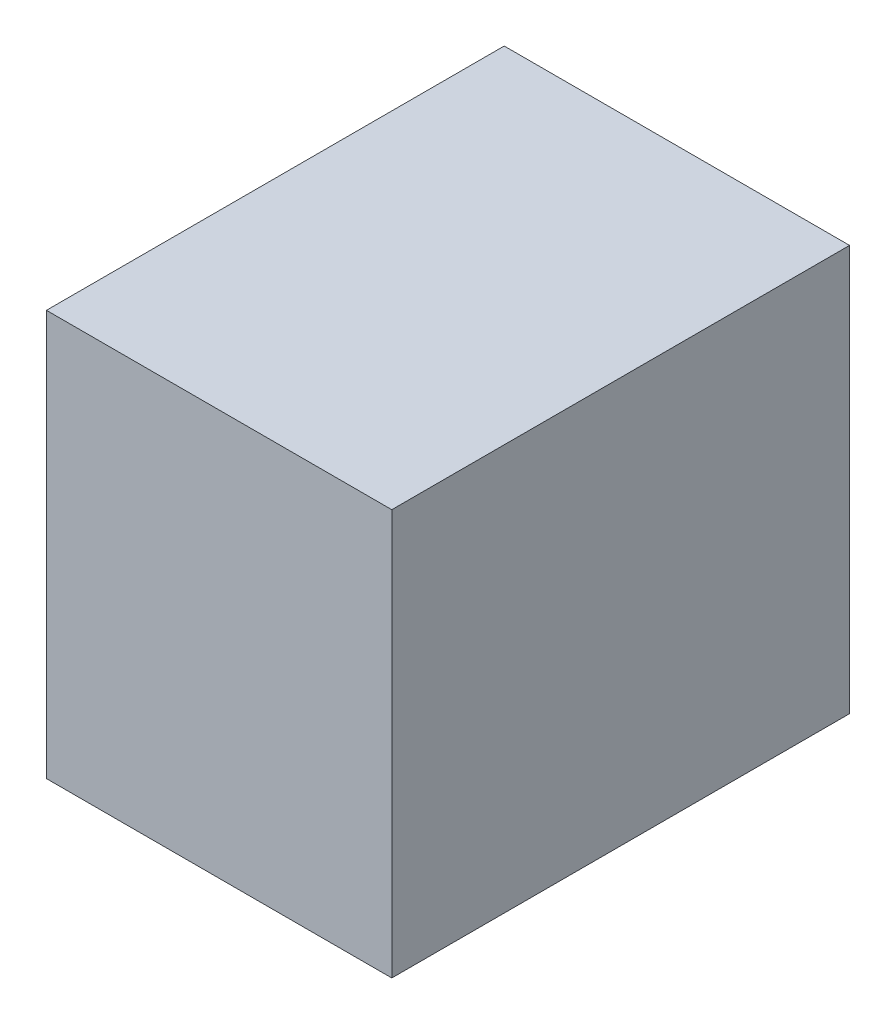
ISO-10303-21;
HEADER;
FILE_DESCRIPTION(('STEP AP214'),'2;1');
FILE_NAME('part.step','',(''),(''),'','','');
FILE_SCHEMA(('AUTOMOTIVE_DESIGN { 1 0 10303 214 1 1 1 1 }'));
ENDSEC;
DATA;
#1=APPLICATION_CONTEXT('core data for automotive mechanical design processes');
#2=APPLICATION_PROTOCOL_DEFINITION('international standard','automotive_design',2000,#1);
#3=PRODUCT_CONTEXT('',#1,'mechanical');
#4=PRODUCT('Part','Part','',(#3));
#5=PRODUCT_RELATED_PRODUCT_CATEGORY('part','',(#4));
#6=PRODUCT_DEFINITION_FORMATION('','',#4);
#7=PRODUCT_DEFINITION_CONTEXT('part definition',#1,'design');
#8=PRODUCT_DEFINITION('design','',#6,#7);
#9=PRODUCT_DEFINITION_SHAPE('','',#8);
#10=(LENGTH_UNIT() NAMED_UNIT(*) SI_UNIT(.MILLI.,.METRE.));
#11=(NAMED_UNIT(*) PLANE_ANGLE_UNIT() SI_UNIT($,.RADIAN.));
#12=(NAMED_UNIT(*) SI_UNIT($,.STERADIAN.) SOLID_ANGLE_UNIT());
#13=UNCERTAINTY_MEASURE_WITH_UNIT(LENGTH_MEASURE(1.E-05),#10,'distance_accuracy_value','');
#14=(GEOMETRIC_REPRESENTATION_CONTEXT(3) GLOBAL_UNCERTAINTY_ASSIGNED_CONTEXT((#13)) GLOBAL_UNIT_ASSIGNED_CONTEXT((#10,
#11,#12)) REPRESENTATION_CONTEXT('',''));
#15=CARTESIAN_POINT('',(0.,0.,0.));
#16=DIRECTION('',(0.,0.,1.));
#17=DIRECTION('',(1.,0.,0.));
#18=AXIS2_PLACEMENT_3D('',#15,#16,#17);
#19=CARTESIAN_POINT('',(3.15957446808511,-6.9967362482587,25.5));
#20=DIRECTION('',(0.,-1.,0.));
#21=DIRECTION('',(1.,0.,0.));
#22=AXIS2_PLACEMENT_3D('',#19,#20,#21);
#23=PLANE('',#22);
#24=DIRECTION('',(-1.,0.,0.));
#25=VECTOR('',#24,1.);
#26=CARTESIAN_POINT('',(3.15957446808511,-6.9967362482587,0.));
#27=LINE('',#26,#25);
#28=CARTESIAN_POINT('',(3.15957446808511,-6.9967362482587,0.));
#29=VERTEX_POINT('',#28);
#30=CARTESIAN_POINT('',(-12.3404255319149,-6.9967362482587,0.));
#31=VERTEX_POINT('',#30);
#32=EDGE_CURVE('E148',#29,#31,#27,.T.);
#33=ORIENTED_EDGE('',*,*,#32,.T.);
#34=DIRECTION('',(0.,0.,-1.));
#35=VECTOR('',#34,1.);
#36=CARTESIAN_POINT('',(-12.3404255319149,-6.9967362482587,25.5));
#37=LINE('',#36,#35);
#38=CARTESIAN_POINT('',(-12.3404255319149,-6.9967362482587,25.5));
#39=VERTEX_POINT('',#38);
#40=EDGE_CURVE('E11',#39,#31,#37,.T.);
#41=ORIENTED_EDGE('',*,*,#40,.F.);
#42=DIRECTION('',(-1.,0.,0.));
#43=VECTOR('',#42,1.);
#44=CARTESIAN_POINT('',(3.15957446808511,-6.9967362482587,25.5));
#45=LINE('',#44,#43);
#46=CARTESIAN_POINT('',(3.15957446808511,-6.9967362482587,25.5));
#47=VERTEX_POINT('',#46);
#48=EDGE_CURVE('E140',#47,#39,#45,.T.);
#49=ORIENTED_EDGE('',*,*,#48,.F.);
#50=DIRECTION('',(0.,0.,-1.));
#51=VECTOR('',#50,1.);
#52=CARTESIAN_POINT('',(3.15957446808511,-6.9967362482587,25.5));
#53=LINE('',#52,#51);
#54=EDGE_CURVE('E147',#47,#29,#53,.T.);
#55=ORIENTED_EDGE('',*,*,#54,.T.);
#56=EDGE_LOOP('',(#33,#41,#49,#55));
#57=FACE_BOUND('',#56,.T.);
#58=ADVANCED_FACE('F36',(#57),#23,.F.);
#59=CARTESIAN_POINT('',(-12.3404255319149,-6.9967362482587,25.5));
#60=DIRECTION('',(-1.,0.,0.));
#61=DIRECTION('',(0.,-1.,0.));
#62=AXIS2_PLACEMENT_3D('',#59,#60,#61);
#63=PLANE('',#62);
#64=DIRECTION('',(0.,1.,0.));
#65=VECTOR('',#64,1.);
#66=CARTESIAN_POINT('',(-12.3404255319149,-6.9967362482587,0.));
#67=LINE('',#66,#65);
#68=CARTESIAN_POINT('',(-12.3404255319149,8.5032637517413,0.));
#69=VERTEX_POINT('',#68);
#70=EDGE_CURVE('E151',#31,#69,#67,.T.);
#71=ORIENTED_EDGE('',*,*,#70,.T.);
#72=DIRECTION('',(0.,0.,-1.));
#73=VECTOR('',#72,1.);
#74=CARTESIAN_POINT('',(-12.3404255319149,8.5032637517413,25.5));
#75=LINE('',#74,#73);
#76=CARTESIAN_POINT('',(-12.3404255319149,8.5032637517413,25.5));
#77=VERTEX_POINT('',#76);
#78=EDGE_CURVE('E44',#77,#69,#75,.T.);
#79=ORIENTED_EDGE('',*,*,#78,.F.);
#80=DIRECTION('',(0.,1.,0.));
#81=VECTOR('',#80,1.);
#82=CARTESIAN_POINT('',(-12.3404255319149,-6.9967362482587,25.5));
#83=LINE('',#82,#81);
#84=EDGE_CURVE('E100',#39,#77,#83,.T.);
#85=ORIENTED_EDGE('',*,*,#84,.F.);
#86=ORIENTED_EDGE('',*,*,#40,.T.);
#87=EDGE_LOOP('',(#71,#79,#85,#86));
#88=FACE_BOUND('',#87,.T.);
#89=ADVANCED_FACE('F225',(#88),#63,.F.);
#90=CARTESIAN_POINT('',(-12.3404255319149,8.5032637517413,25.5));
#91=DIRECTION('',(0.,-1.,0.));
#92=DIRECTION('',(0.,0.,-1.));
#93=AXIS2_PLACEMENT_3D('',#90,#91,#92);
#94=PLANE('',#93);
#95=DIRECTION('',(-1.,0.,0.));
#96=VECTOR('',#95,1.);
#97=CARTESIAN_POINT('',(-12.3404255319149,8.5032637517413,0.));
#98=LINE('',#97,#96);
#99=CARTESIAN_POINT('',(-15.3404255319149,8.5032637517413,0.));
#100=VERTEX_POINT('',#99);
#101=EDGE_CURVE('E115',#69,#100,#98,.T.);
#102=ORIENTED_EDGE('',*,*,#101,.T.);
#103=DIRECTION('',(0.,0.,-1.));
#104=VECTOR('',#103,1.);
#105=CARTESIAN_POINT('',(-15.3404255319149,8.5032637517413,25.5));
#106=LINE('',#105,#104);
#107=CARTESIAN_POINT('',(-15.3404255319149,8.5032637517413,25.5));
#108=VERTEX_POINT('',#107);
#109=EDGE_CURVE('E109',#108,#100,#106,.T.);
#110=ORIENTED_EDGE('',*,*,#109,.F.);
#111=DIRECTION('',(-1.,0.,0.));
#112=VECTOR('',#111,1.);
#113=CARTESIAN_POINT('',(-12.3404255319149,8.5032637517413,25.5));
#114=LINE('',#113,#112);
#115=EDGE_CURVE('E113',#77,#108,#114,.T.);
#116=ORIENTED_EDGE('',*,*,#115,.F.);
#117=ORIENTED_EDGE('',*,*,#78,.T.);
#118=EDGE_LOOP('',(#102,#110,#116,#117));
#119=FACE_BOUND('',#118,.T.);
#120=ADVANCED_FACE('F111',(#119),#94,.F.);
#121=CARTESIAN_POINT('',(-15.3404255319149,-9.9967362482587,25.5));
#122=DIRECTION('',(0.,1.,0.));
#123=DIRECTION('',(0.,0.,1.));
#124=AXIS2_PLACEMENT_3D('',#121,#122,#123);
#125=PLANE('',#124);
#126=DIRECTION('',(1.,0.,0.));
#127=VECTOR('',#126,1.);
#128=CARTESIAN_POINT('',(-15.3404255319149,-9.9967362482587,0.));
#129=LINE('',#128,#127);
#130=CARTESIAN_POINT('',(-15.3404255319149,-9.9967362482587,0.));
#131=VERTEX_POINT('',#130);
#132=CARTESIAN_POINT('',(6.15957446808511,-9.9967362482587,0.));
#133=VERTEX_POINT('',#132);
#134=EDGE_CURVE('E156',#131,#133,#129,.T.);
#135=ORIENTED_EDGE('',*,*,#134,.T.);
#136=DIRECTION('',(0.,0.,-1.));
#137=VECTOR('',#136,1.);
#138=CARTESIAN_POINT('',(6.15957446808511,-9.9967362482587,25.5));
#139=LINE('',#138,#137);
#140=CARTESIAN_POINT('',(6.15957446808511,-9.9967362482587,28.5));
#141=VERTEX_POINT('',#140);
#142=EDGE_CURVE('E175',#141,#133,#139,.T.);
#143=ORIENTED_EDGE('',*,*,#142,.F.);
#144=DIRECTION('',(1.,0.,0.));
#145=VECTOR('',#144,1.);
#146=CARTESIAN_POINT('',(6.15957446808511,-9.9967362482587,28.5));
#147=LINE('',#146,#145);
#148=CARTESIAN_POINT('',(-15.3404255319149,-9.9967362482587,28.5));
#149=VERTEX_POINT('',#148);
#150=EDGE_CURVE('E134',#149,#141,#147,.T.);
#151=ORIENTED_EDGE('',*,*,#150,.F.);
#152=DIRECTION('',(0.,0.,-1.));
#153=VECTOR('',#152,1.);
#154=CARTESIAN_POINT('',(-15.3404255319149,-9.9967362482587,25.5));
#155=LINE('',#154,#153);
#156=EDGE_CURVE('E119',#149,#131,#155,.T.);
#157=ORIENTED_EDGE('',*,*,#156,.T.);
#158=EDGE_LOOP('',(#135,#143,#151,#157));
#159=FACE_BOUND('',#158,.T.);
#160=ADVANCED_FACE('F189',(#159),#125,.F.);
#161=CARTESIAN_POINT('',(6.15957446808511,-9.9967362482587,25.5));
#162=DIRECTION('',(-1.,0.,0.));
#163=DIRECTION('',(0.,0.,1.));
#164=AXIS2_PLACEMENT_3D('',#161,#162,#163);
#165=PLANE('',#164);
#166=DIRECTION('',(0.,1.,0.));
#167=VECTOR('',#166,1.);
#168=CARTESIAN_POINT('',(6.15957446808511,-9.9967362482587,0.));
#169=LINE('',#168,#167);
#170=CARTESIAN_POINT('',(6.15957446808511,15.2532637517413,0.));
#171=VERTEX_POINT('',#170);
#172=EDGE_CURVE('E158',#133,#171,#169,.T.);
#173=ORIENTED_EDGE('',*,*,#172,.T.);
#174=DIRECTION('',(0.,0.,-1.));
#175=VECTOR('',#174,1.);
#176=CARTESIAN_POINT('',(6.15957446808511,15.2532637517413,25.5));
#177=LINE('',#176,#175);
#178=CARTESIAN_POINT('',(6.15957446808511,15.2532637517413,28.5));
#179=VERTEX_POINT('',#178);
#180=EDGE_CURVE('E172',#179,#171,#177,.T.);
#181=ORIENTED_EDGE('',*,*,#180,.F.);
#182=DIRECTION('',(0.,1.,0.));
#183=VECTOR('',#182,1.);
#184=CARTESIAN_POINT('',(6.15957446808511,15.2532637517413,28.5));
#185=LINE('',#184,#183);
#186=EDGE_CURVE('E197',#141,#179,#185,.T.);
#187=ORIENTED_EDGE('',*,*,#186,.F.);
#188=ORIENTED_EDGE('',*,*,#142,.T.);
#189=EDGE_LOOP('',(#173,#181,#187,#188));
#190=FACE_BOUND('',#189,.T.);
#191=ADVANCED_FACE('F212',(#190),#165,.F.);
#192=CARTESIAN_POINT('',(6.15957446808511,15.2532637517413,25.5));
#193=DIRECTION('',(0.,-1.,0.));
#194=DIRECTION('',(0.,0.,-1.));
#195=AXIS2_PLACEMENT_3D('',#192,#193,#194);
#196=PLANE('',#195);
#197=DIRECTION('',(-1.,0.,0.));
#198=VECTOR('',#197,1.);
#199=CARTESIAN_POINT('',(6.15957446808511,15.2532637517413,0.));
#200=LINE('',#199,#198);
#201=CARTESIAN_POINT('',(-15.3404255319149,15.2532637517413,0.));
#202=VERTEX_POINT('',#201);
#203=EDGE_CURVE('E160',#171,#202,#200,.T.);
#204=ORIENTED_EDGE('',*,*,#203,.T.);
#205=DIRECTION('',(0.,0.,-1.));
#206=VECTOR('',#205,1.);
#207=CARTESIAN_POINT('',(-15.3404255319149,15.2532637517413,25.5));
#208=LINE('',#207,#206);
#209=CARTESIAN_POINT('',(-15.3404255319149,15.2532637517413,28.5));
#210=VERTEX_POINT('',#209);
#211=EDGE_CURVE('E169',#210,#202,#208,.T.);
#212=ORIENTED_EDGE('',*,*,#211,.F.);
#213=DIRECTION('',(-1.,0.,0.));
#214=VECTOR('',#213,1.);
#215=CARTESIAN_POINT('',(-15.3404255319149,15.2532637517413,28.5));
#216=LINE('',#215,#214);
#217=EDGE_CURVE('E138',#179,#210,#216,.T.);
#218=ORIENTED_EDGE('',*,*,#217,.F.);
#219=ORIENTED_EDGE('',*,*,#180,.T.);
#220=EDGE_LOOP('',(#204,#212,#218,#219));
#221=FACE_BOUND('',#220,.T.);
#222=ADVANCED_FACE('F214',(#221),#196,.F.);
#223=CARTESIAN_POINT('',(-15.3404255319149,15.2532637517413,25.5));
#224=DIRECTION('',(1.,0.,0.));
#225=DIRECTION('',(0.,1.,0.));
#226=AXIS2_PLACEMENT_3D('',#223,#224,#225);
#227=PLANE('',#226);
#228=DIRECTION('',(0.,-1.,0.));
#229=VECTOR('',#228,1.);
#230=CARTESIAN_POINT('',(-15.3404255319149,15.2532637517413,0.));
#231=LINE('',#230,#229);
#232=CARTESIAN_POINT('',(-15.3404255319149,12.2532637517413,0.));
#233=VERTEX_POINT('',#232);
#234=EDGE_CURVE('E162',#202,#233,#231,.T.);
#235=ORIENTED_EDGE('',*,*,#234,.T.);
#236=DIRECTION('',(0.,0.,-1.));
#237=VECTOR('',#236,1.);
#238=CARTESIAN_POINT('',(-15.3404255319149,12.2532637517413,25.5));
#239=LINE('',#238,#237);
#240=CARTESIAN_POINT('',(-15.3404255319149,12.2532637517413,25.5));
#241=VERTEX_POINT('',#240);
#242=EDGE_CURVE('E130',#241,#233,#239,.T.);
#243=ORIENTED_EDGE('',*,*,#242,.F.);
#244=DIRECTION('',(0.,-1.,0.));
#245=VECTOR('',#244,1.);
#246=CARTESIAN_POINT('',(-15.3404255319149,-9.9967362482587,25.5));
#247=LINE('',#246,#245);
#248=EDGE_CURVE('E125',#241,#108,#247,.T.);
#249=ORIENTED_EDGE('',*,*,#248,.T.);
#250=ORIENTED_EDGE('',*,*,#109,.T.);
#251=DIRECTION('',(0.,-1.,0.));
#252=VECTOR('',#251,1.);
#253=CARTESIAN_POINT('',(-15.3404255319149,8.5032637517413,0.));
#254=LINE('',#253,#252);
#255=EDGE_CURVE('E154',#100,#131,#254,.T.);
#256=ORIENTED_EDGE('',*,*,#255,.T.);
#257=ORIENTED_EDGE('',*,*,#156,.F.);
#258=DIRECTION('',(0.,-1.,0.));
#259=VECTOR('',#258,1.);
#260=CARTESIAN_POINT('',(-15.3404255319149,-9.9967362482587,28.5));
#261=LINE('',#260,#259);
#262=EDGE_CURVE('E131',#210,#149,#261,.T.);
#263=ORIENTED_EDGE('',*,*,#262,.F.);
#264=ORIENTED_EDGE('',*,*,#211,.T.);
#265=EDGE_LOOP('',(#235,#243,#249,#250,#256,#257,#263,#264));
#266=FACE_BOUND('',#265,.T.);
#267=ADVANCED_FACE('F129',(#266),#227,.F.);
#268=CARTESIAN_POINT('',(-15.3404255319149,12.2532637517413,25.5));
#269=DIRECTION('',(0.,1.,0.));
#270=DIRECTION('',(-1.,0.,0.));
#271=AXIS2_PLACEMENT_3D('',#268,#269,#270);
#272=PLANE('',#271);
#273=DIRECTION('',(1.,0.,0.));
#274=VECTOR('',#273,1.);
#275=CARTESIAN_POINT('',(-15.3404255319149,12.2532637517413,0.));
#276=LINE('',#275,#274);
#277=CARTESIAN_POINT('',(3.1595744680851,12.2532637517413,0.));
#278=VERTEX_POINT('',#277);
#279=EDGE_CURVE('E86',#233,#278,#276,.T.);
#280=ORIENTED_EDGE('',*,*,#279,.T.);
#281=DIRECTION('',(0.,0.,-1.));
#282=VECTOR('',#281,1.);
#283=CARTESIAN_POINT('',(3.1595744680851,12.2532637517413,25.5));
#284=LINE('',#283,#282);
#285=CARTESIAN_POINT('',(3.1595744680851,12.2532637517413,25.5));
#286=VERTEX_POINT('',#285);
#287=EDGE_CURVE('E52',#286,#278,#284,.T.);
#288=ORIENTED_EDGE('',*,*,#287,.F.);
#289=DIRECTION('',(1.,0.,0.));
#290=VECTOR('',#289,1.);
#291=CARTESIAN_POINT('',(-15.3404255319149,12.2532637517413,25.5));
#292=LINE('',#291,#290);
#293=EDGE_CURVE('E127',#241,#286,#292,.T.);
#294=ORIENTED_EDGE('',*,*,#293,.F.);
#295=ORIENTED_EDGE('',*,*,#242,.T.);
#296=EDGE_LOOP('',(#280,#288,#294,#295));
#297=FACE_BOUND('',#296,.T.);
#298=ADVANCED_FACE('F221',(#297),#272,.F.);
#299=CARTESIAN_POINT('',(3.1595744680851,12.2532637517413,25.5));
#300=DIRECTION('',(1.,0.,0.));
#301=DIRECTION('',(0.,1.,0.));
#302=AXIS2_PLACEMENT_3D('',#299,#300,#301);
#303=PLANE('',#302);
#304=DIRECTION('',(0.,-1.,0.));
#305=VECTOR('',#304,1.);
#306=CARTESIAN_POINT('',(3.1595744680851,12.2532637517413,0.));
#307=LINE('',#306,#305);
#308=EDGE_CURVE('E92',#278,#29,#307,.T.);
#309=ORIENTED_EDGE('',*,*,#308,.T.);
#310=ORIENTED_EDGE('',*,*,#54,.F.);
#311=DIRECTION('',(0.,-1.,0.));
#312=VECTOR('',#311,1.);
#313=CARTESIAN_POINT('',(3.1595744680851,12.2532637517413,25.5));
#314=LINE('',#313,#312);
#315=EDGE_CURVE('E144',#286,#47,#314,.T.);
#316=ORIENTED_EDGE('',*,*,#315,.F.);
#317=ORIENTED_EDGE('',*,*,#287,.T.);
#318=EDGE_LOOP('',(#309,#310,#316,#317));
#319=FACE_BOUND('',#318,.T.);
#320=ADVANCED_FACE('F230',(#319),#303,.F.);
#321=CARTESIAN_POINT('',(0.,0.,0.));
#322=DIRECTION('',(0.,0.,-1.));
#323=DIRECTION('',(-1.,0.,0.));
#324=AXIS2_PLACEMENT_3D('',#321,#322,#323);
#325=PLANE('',#324);
#326=ORIENTED_EDGE('',*,*,#32,.F.);
#327=ORIENTED_EDGE('',*,*,#308,.F.);
#328=ORIENTED_EDGE('',*,*,#279,.F.);
#329=ORIENTED_EDGE('',*,*,#234,.F.);
#330=ORIENTED_EDGE('',*,*,#203,.F.);
#331=ORIENTED_EDGE('',*,*,#172,.F.);
#332=ORIENTED_EDGE('',*,*,#134,.F.);
#333=ORIENTED_EDGE('',*,*,#255,.F.);
#334=ORIENTED_EDGE('',*,*,#101,.F.);
#335=ORIENTED_EDGE('',*,*,#70,.F.);
#336=EDGE_LOOP('',(#326,#327,#328,#329,#330,#331,#332,#333,#334,#335));
#337=FACE_BOUND('',#336,.T.);
#338=ADVANCED_FACE('F181',(#337),#325,.T.);
#339=CARTESIAN_POINT('',(0.,0.,28.5));
#340=DIRECTION('',(0.,0.,-1.));
#341=DIRECTION('',(-1.,0.,0.));
#342=AXIS2_PLACEMENT_3D('',#339,#340,#341);
#343=PLANE('',#342);
#344=ORIENTED_EDGE('',*,*,#262,.T.);
#345=ORIENTED_EDGE('',*,*,#150,.T.);
#346=ORIENTED_EDGE('',*,*,#186,.T.);
#347=ORIENTED_EDGE('',*,*,#217,.T.);
#348=EDGE_LOOP('',(#344,#345,#346,#347));
#349=FACE_BOUND('',#348,.T.);
#350=ADVANCED_FACE('F200',(#349),#343,.F.);
#351=CARTESIAN_POINT('',(0.,0.,25.5));
#352=DIRECTION('',(0.,0.,-1.));
#353=DIRECTION('',(-1.,0.,0.));
#354=AXIS2_PLACEMENT_3D('',#351,#352,#353);
#355=PLANE('',#354);
#356=ORIENTED_EDGE('',*,*,#84,.T.);
#357=ORIENTED_EDGE('',*,*,#115,.T.);
#358=ORIENTED_EDGE('',*,*,#248,.F.);
#359=ORIENTED_EDGE('',*,*,#293,.T.);
#360=ORIENTED_EDGE('',*,*,#315,.T.);
#361=ORIENTED_EDGE('',*,*,#48,.T.);
#362=EDGE_LOOP('',(#356,#357,#358,#359,#360,#361));
#363=FACE_BOUND('',#362,.T.);
#364=ADVANCED_FACE('F123',(#363),#355,.T.);
#365=CLOSED_SHELL('',(#58,#89,#120,#160,#191,#222,#267,#298,#320,#338,#350,#364));
#366=MANIFOLD_SOLID_BREP('B2',#365);
#367=ADVANCED_BREP_SHAPE_REPRESENTATION('',(#18,#366),#14);
#368=SHAPE_DEFINITION_REPRESENTATION(#9,#367);
ENDSEC;
END-ISO-10303-21;
